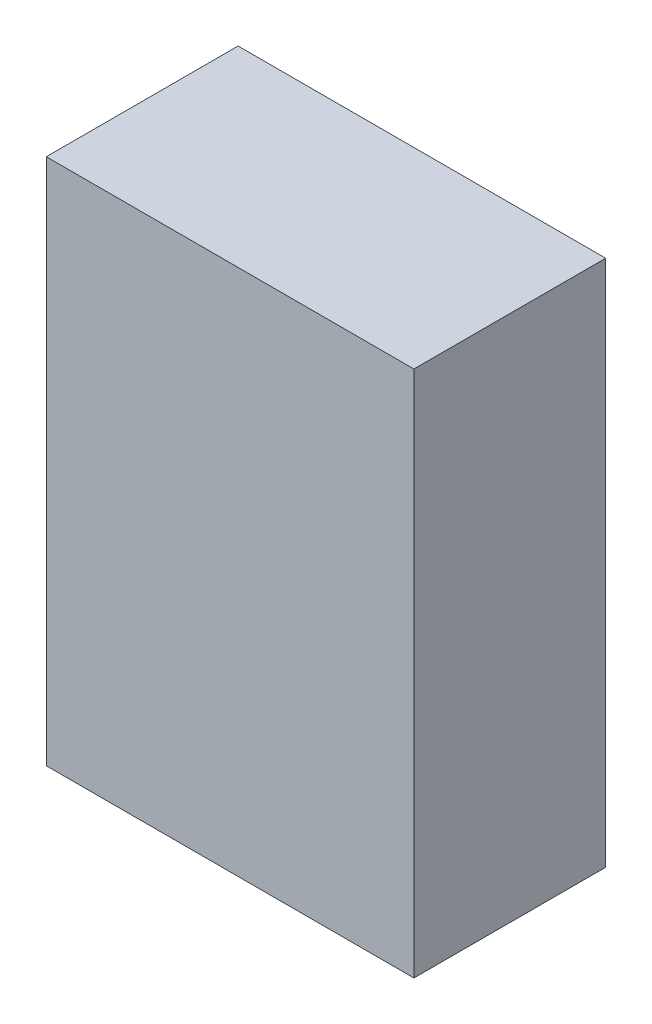
ISO-10303-21;
HEADER;
FILE_DESCRIPTION(('STEP AP214'),'2;1');
FILE_NAME('part.step','',(''),(''),'','','');
FILE_SCHEMA(('AUTOMOTIVE_DESIGN { 1 0 10303 214 1 1 1 1 }'));
ENDSEC;
DATA;
#1=APPLICATION_CONTEXT('core data for automotive mechanical design processes');
#2=APPLICATION_PROTOCOL_DEFINITION('international standard','automotive_design',2000,#1);
#3=PRODUCT_CONTEXT('',#1,'mechanical');
#4=PRODUCT('Part','Part','',(#3));
#5=PRODUCT_RELATED_PRODUCT_CATEGORY('part','',(#4));
#6=PRODUCT_DEFINITION_FORMATION('','',#4);
#7=PRODUCT_DEFINITION_CONTEXT('part definition',#1,'design');
#8=PRODUCT_DEFINITION('design','',#6,#7);
#9=PRODUCT_DEFINITION_SHAPE('','',#8);
#10=(LENGTH_UNIT() NAMED_UNIT(*) SI_UNIT(.MILLI.,.METRE.));
#11=(NAMED_UNIT(*) PLANE_ANGLE_UNIT() SI_UNIT($,.RADIAN.));
#12=(NAMED_UNIT(*) SI_UNIT($,.STERADIAN.) SOLID_ANGLE_UNIT());
#13=UNCERTAINTY_MEASURE_WITH_UNIT(LENGTH_MEASURE(1.E-05),#10,'distance_accuracy_value','');
#14=(GEOMETRIC_REPRESENTATION_CONTEXT(3) GLOBAL_UNCERTAINTY_ASSIGNED_CONTEXT((#13)) GLOBAL_UNIT_ASSIGNED_CONTEXT((#10,
#11,#12)) REPRESENTATION_CONTEXT('',''));
#15=CARTESIAN_POINT('',(0.,0.,0.));
#16=DIRECTION('',(0.,0.,1.));
#17=DIRECTION('',(1.,0.,0.));
#18=AXIS2_PLACEMENT_3D('',#15,#16,#17);
#19=CARTESIAN_POINT('',(0.,0.,0.));
#20=DIRECTION('',(0.,0.,1.));
#21=DIRECTION('',(1.,0.,0.));
#22=AXIS2_PLACEMENT_3D('',#19,#20,#21);
#23=PLANE('',#22);
#24=DIRECTION('',(0.,-1.,0.));
#25=VECTOR('',#24,1.);
#26=CARTESIAN_POINT('',(-11.9074668524644,0.,0.));
#27=LINE('',#26,#25);
#28=CARTESIAN_POINT('',(-11.9074668524644,7.02620863779063,0.));
#29=VERTEX_POINT('',#28);
#30=CARTESIAN_POINT('',(-11.9074668524644,-58.9737913622094,0.));
#31=VERTEX_POINT('',#30);
#32=EDGE_CURVE('E100',#29,#31,#27,.T.);
#33=ORIENTED_EDGE('',*,*,#32,.T.);
#34=DIRECTION('',(1.,0.,0.));
#35=VECTOR('',#34,1.);
#36=CARTESIAN_POINT('',(0.,-58.9737913622094,0.));
#37=LINE('',#36,#35);
#38=CARTESIAN_POINT('',(-57.9074668524644,-58.9737913622094,0.));
#39=VERTEX_POINT('',#38);
#40=EDGE_CURVE('E96',#39,#31,#37,.T.);
#41=ORIENTED_EDGE('',*,*,#40,.F.);
#42=DIRECTION('',(0.,-1.,0.));
#43=VECTOR('',#42,1.);
#44=CARTESIAN_POINT('',(-57.9074668524644,0.,0.));
#45=LINE('',#44,#43);
#46=CARTESIAN_POINT('',(-57.9074668524644,7.02620863779063,0.));
#47=VERTEX_POINT('',#46);
#48=EDGE_CURVE('E68',#47,#39,#45,.T.);
#49=ORIENTED_EDGE('',*,*,#48,.F.);
#50=DIRECTION('',(1.,0.,0.));
#51=VECTOR('',#50,1.);
#52=CARTESIAN_POINT('',(0.,7.02620863779063,0.));
#53=LINE('',#52,#51);
#54=EDGE_CURVE('E88',#47,#29,#53,.T.);
#55=ORIENTED_EDGE('',*,*,#54,.T.);
#56=EDGE_LOOP('',(#33,#41,#49,#55));
#57=FACE_BOUND('',#56,.T.);
#58=ADVANCED_FACE('F36',(#57),#23,.F.);
#59=CARTESIAN_POINT('',(-57.9074668524644,0.,24.));
#60=DIRECTION('',(1.,0.,0.));
#61=DIRECTION('',(0.,1.,0.));
#62=AXIS2_PLACEMENT_3D('',#59,#60,#61);
#63=PLANE('',#62);
#64=ORIENTED_EDGE('',*,*,#48,.T.);
#65=DIRECTION('',(0.,0.,-1.));
#66=VECTOR('',#65,1.);
#67=CARTESIAN_POINT('',(-57.9074668524644,-58.9737913622094,24.));
#68=LINE('',#67,#66);
#69=CARTESIAN_POINT('',(-57.9074668524644,-58.9737913622094,24.));
#70=VERTEX_POINT('',#69);
#71=EDGE_CURVE('E89',#70,#39,#68,.T.);
#72=ORIENTED_EDGE('',*,*,#71,.F.);
#73=DIRECTION('',(0.,-1.,0.));
#74=VECTOR('',#73,1.);
#75=CARTESIAN_POINT('',(-57.9074668524644,0.,24.));
#76=LINE('',#75,#74);
#77=CARTESIAN_POINT('',(-57.9074668524644,7.02620863779063,24.));
#78=VERTEX_POINT('',#77);
#79=EDGE_CURVE('E90',#78,#70,#76,.T.);
#80=ORIENTED_EDGE('',*,*,#79,.F.);
#81=DIRECTION('',(0.,0.,-1.));
#82=VECTOR('',#81,1.);
#83=CARTESIAN_POINT('',(-57.9074668524644,7.02620863779063,24.));
#84=LINE('',#83,#82);
#85=EDGE_CURVE('E45',#78,#47,#84,.T.);
#86=ORIENTED_EDGE('',*,*,#85,.T.);
#87=EDGE_LOOP('',(#64,#72,#80,#86));
#88=FACE_BOUND('',#87,.T.);
#89=ADVANCED_FACE('F91',(#88),#63,.F.);
#90=CARTESIAN_POINT('',(0.,7.02620863779063,24.));
#91=DIRECTION('',(0.,1.,0.));
#92=DIRECTION('',(0.,0.,1.));
#93=AXIS2_PLACEMENT_3D('',#90,#91,#92);
#94=PLANE('',#93);
#95=ORIENTED_EDGE('',*,*,#54,.F.);
#96=ORIENTED_EDGE('',*,*,#85,.F.);
#97=DIRECTION('',(1.,0.,0.));
#98=VECTOR('',#97,1.);
#99=CARTESIAN_POINT('',(0.,7.02620863779063,24.));
#100=LINE('',#99,#98);
#101=CARTESIAN_POINT('',(-11.9074668524644,7.02620863779063,24.));
#102=VERTEX_POINT('',#101);
#103=EDGE_CURVE('E86',#78,#102,#100,.T.);
#104=ORIENTED_EDGE('',*,*,#103,.T.);
#105=DIRECTION('',(0.,0.,-1.));
#106=VECTOR('',#105,1.);
#107=CARTESIAN_POINT('',(-11.9074668524644,7.02620863779063,24.));
#108=LINE('',#107,#106);
#109=EDGE_CURVE('E11',#102,#29,#108,.T.);
#110=ORIENTED_EDGE('',*,*,#109,.T.);
#111=EDGE_LOOP('',(#95,#96,#104,#110));
#112=FACE_BOUND('',#111,.T.);
#113=ADVANCED_FACE('F84',(#112),#94,.T.);
#114=CARTESIAN_POINT('',(-11.9074668524644,0.,24.));
#115=DIRECTION('',(1.,0.,0.));
#116=DIRECTION('',(0.,1.,0.));
#117=AXIS2_PLACEMENT_3D('',#114,#115,#116);
#118=PLANE('',#117);
#119=ORIENTED_EDGE('',*,*,#32,.F.);
#120=ORIENTED_EDGE('',*,*,#109,.F.);
#121=DIRECTION('',(0.,-1.,0.));
#122=VECTOR('',#121,1.);
#123=CARTESIAN_POINT('',(-11.9074668524644,0.,24.));
#124=LINE('',#123,#122);
#125=CARTESIAN_POINT('',(-11.9074668524644,-58.9737913622094,24.));
#126=VERTEX_POINT('',#125);
#127=EDGE_CURVE('E94',#102,#126,#124,.T.);
#128=ORIENTED_EDGE('',*,*,#127,.T.);
#129=DIRECTION('',(0.,0.,-1.));
#130=VECTOR('',#129,1.);
#131=CARTESIAN_POINT('',(-11.9074668524644,-58.9737913622094,24.));
#132=LINE('',#131,#130);
#133=EDGE_CURVE('E75',#126,#31,#132,.T.);
#134=ORIENTED_EDGE('',*,*,#133,.T.);
#135=EDGE_LOOP('',(#119,#120,#128,#134));
#136=FACE_BOUND('',#135,.T.);
#137=ADVANCED_FACE('F38',(#136),#118,.T.);
#138=CARTESIAN_POINT('',(0.,-58.9737913622094,24.));
#139=DIRECTION('',(0.,1.,0.));
#140=DIRECTION('',(0.,0.,1.));
#141=AXIS2_PLACEMENT_3D('',#138,#139,#140);
#142=PLANE('',#141);
#143=ORIENTED_EDGE('',*,*,#40,.T.);
#144=ORIENTED_EDGE('',*,*,#133,.F.);
#145=DIRECTION('',(1.,0.,0.));
#146=VECTOR('',#145,1.);
#147=CARTESIAN_POINT('',(0.,-58.9737913622094,24.));
#148=LINE('',#147,#146);
#149=EDGE_CURVE('E53',#70,#126,#148,.T.);
#150=ORIENTED_EDGE('',*,*,#149,.F.);
#151=ORIENTED_EDGE('',*,*,#71,.T.);
#152=EDGE_LOOP('',(#143,#144,#150,#151));
#153=FACE_BOUND('',#152,.T.);
#154=ADVANCED_FACE('F109',(#153),#142,.F.);
#155=CARTESIAN_POINT('',(0.,0.,24.));
#156=DIRECTION('',(0.,0.,1.));
#157=DIRECTION('',(1.,0.,0.));
#158=AXIS2_PLACEMENT_3D('',#155,#156,#157);
#159=PLANE('',#158);
#160=ORIENTED_EDGE('',*,*,#127,.F.);
#161=ORIENTED_EDGE('',*,*,#103,.F.);
#162=ORIENTED_EDGE('',*,*,#79,.T.);
#163=ORIENTED_EDGE('',*,*,#149,.T.);
#164=EDGE_LOOP('',(#160,#161,#162,#163));
#165=FACE_BOUND('',#164,.T.);
#166=ADVANCED_FACE('F93',(#165),#159,.T.);
#167=CLOSED_SHELL('',(#58,#89,#113,#137,#154,#166));
#168=MANIFOLD_SOLID_BREP('B2',#167);
#169=ADVANCED_BREP_SHAPE_REPRESENTATION('',(#18,#168),#14);
#170=SHAPE_DEFINITION_REPRESENTATION(#9,#169);
ENDSEC;
END-ISO-10303-21;
